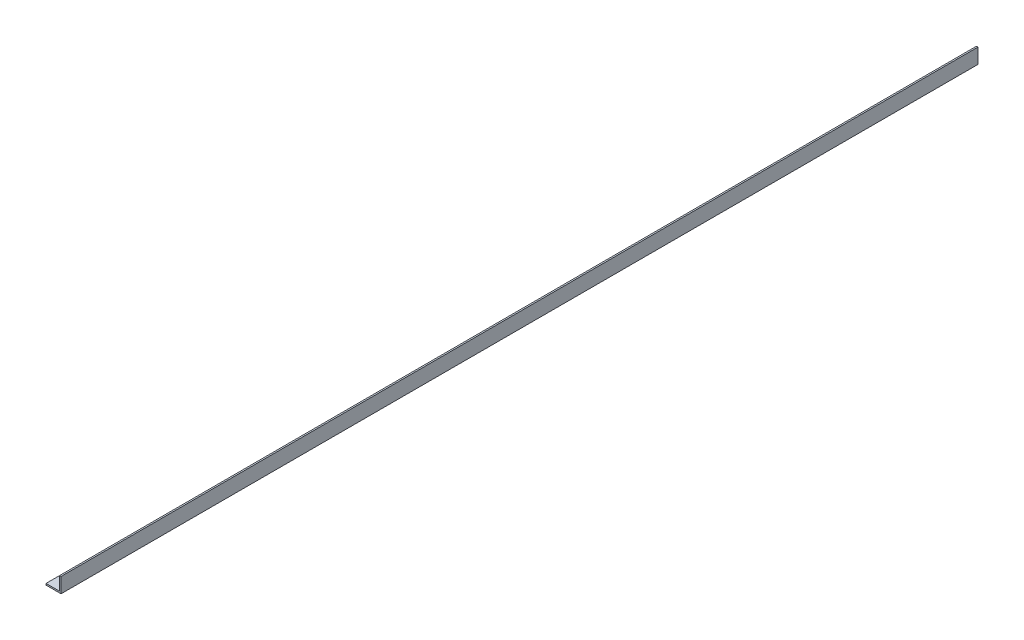
ISO-10303-21;
HEADER;
FILE_DESCRIPTION(('STEP AP214'),'2;1');
FILE_NAME('part.step','',(''),(''),'','','');
FILE_SCHEMA(('AUTOMOTIVE_DESIGN { 1 0 10303 214 1 1 1 1 }'));
ENDSEC;
DATA;
#1=APPLICATION_CONTEXT('core data for automotive mechanical design processes');
#2=APPLICATION_PROTOCOL_DEFINITION('international standard','automotive_design',2000,#1);
#3=PRODUCT_CONTEXT('',#1,'mechanical');
#4=PRODUCT('Part','Part','',(#3));
#5=PRODUCT_RELATED_PRODUCT_CATEGORY('part','',(#4));
#6=PRODUCT_DEFINITION_FORMATION('','',#4);
#7=PRODUCT_DEFINITION_CONTEXT('part definition',#1,'design');
#8=PRODUCT_DEFINITION('design','',#6,#7);
#9=PRODUCT_DEFINITION_SHAPE('','',#8);
#10=(LENGTH_UNIT() NAMED_UNIT(*) SI_UNIT(.MILLI.,.METRE.));
#11=(NAMED_UNIT(*) PLANE_ANGLE_UNIT() SI_UNIT($,.RADIAN.));
#12=(NAMED_UNIT(*) SI_UNIT($,.STERADIAN.) SOLID_ANGLE_UNIT());
#13=UNCERTAINTY_MEASURE_WITH_UNIT(LENGTH_MEASURE(1.E-05),#10,'distance_accuracy_value','');
#14=(GEOMETRIC_REPRESENTATION_CONTEXT(3) GLOBAL_UNCERTAINTY_ASSIGNED_CONTEXT((#13)) GLOBAL_UNIT_ASSIGNED_CONTEXT((#10,
#11,#12)) REPRESENTATION_CONTEXT('',''));
#15=CARTESIAN_POINT('',(0.,0.,0.));
#16=DIRECTION('',(0.,0.,1.));
#17=DIRECTION('',(1.,0.,0.));
#18=AXIS2_PLACEMENT_3D('',#15,#16,#17);
#19=CARTESIAN_POINT('',(-10.,0.,304.8));
#20=DIRECTION('',(1.,0.,0.));
#21=DIRECTION('',(0.,0.,-1.));
#22=AXIS2_PLACEMENT_3D('',#19,#20,#21);
#23=PLANE('',#22);
#24=DIRECTION('',(0.,0.,-1.));
#25=VECTOR('',#24,1.);
#26=CARTESIAN_POINT('',(-10.,0.999999999999999,304.8));
#27=LINE('',#26,#25);
#28=CARTESIAN_POINT('',(-10.,0.999999999999999,304.8));
#29=VERTEX_POINT('',#28);
#30=CARTESIAN_POINT('',(-10.,0.999999999999999,-304.8));
#31=VERTEX_POINT('',#30);
#32=EDGE_CURVE('E119',#29,#31,#27,.T.);
#33=ORIENTED_EDGE('',*,*,#32,.T.);
#34=DIRECTION('',(0.,-1.,0.));
#35=VECTOR('',#34,1.);
#36=CARTESIAN_POINT('',(-10.,0.,-304.8));
#37=LINE('',#36,#35);
#38=CARTESIAN_POINT('',(-10.,0.,-304.8));
#39=VERTEX_POINT('',#38);
#40=EDGE_CURVE('E112',#31,#39,#37,.T.);
#41=ORIENTED_EDGE('',*,*,#40,.T.);
#42=DIRECTION('',(0.,0.,-1.));
#43=VECTOR('',#42,1.);
#44=CARTESIAN_POINT('',(-10.,0.,304.8));
#45=LINE('',#44,#43);
#46=CARTESIAN_POINT('',(-10.,0.,304.8));
#47=VERTEX_POINT('',#46);
#48=EDGE_CURVE('E11',#47,#39,#45,.T.);
#49=ORIENTED_EDGE('',*,*,#48,.F.);
#50=DIRECTION('',(0.,-1.,0.));
#51=VECTOR('',#50,1.);
#52=CARTESIAN_POINT('',(-10.,0.,304.8));
#53=LINE('',#52,#51);
#54=EDGE_CURVE('E136',#29,#47,#53,.T.);
#55=ORIENTED_EDGE('',*,*,#54,.F.);
#56=EDGE_LOOP('',(#33,#41,#49,#55));
#57=FACE_BOUND('',#56,.T.);
#58=ADVANCED_FACE('F47',(#57),#23,.F.);
#59=CARTESIAN_POINT('',(-10.,0.,304.8));
#60=DIRECTION('',(0.,1.,0.));
#61=DIRECTION('',(0.,0.,1.));
#62=AXIS2_PLACEMENT_3D('',#59,#60,#61);
#63=PLANE('',#62);
#64=ORIENTED_EDGE('',*,*,#48,.T.);
#65=DIRECTION('',(1.,0.,0.));
#66=VECTOR('',#65,1.);
#67=CARTESIAN_POINT('',(-10.,0.,-304.8));
#68=LINE('',#67,#66);
#69=CARTESIAN_POINT('',(0.,0.,-304.8));
#70=VERTEX_POINT('',#69);
#71=EDGE_CURVE('E102',#39,#70,#68,.T.);
#72=ORIENTED_EDGE('',*,*,#71,.T.);
#73=DIRECTION('',(0.,0.,-1.));
#74=VECTOR('',#73,1.);
#75=CARTESIAN_POINT('',(0.,0.,304.8));
#76=LINE('',#75,#74);
#77=CARTESIAN_POINT('',(0.,0.,304.8));
#78=VERTEX_POINT('',#77);
#79=EDGE_CURVE('E55',#78,#70,#76,.T.);
#80=ORIENTED_EDGE('',*,*,#79,.F.);
#81=DIRECTION('',(1.,0.,0.));
#82=VECTOR('',#81,1.);
#83=CARTESIAN_POINT('',(-10.,0.,304.8));
#84=LINE('',#83,#82);
#85=EDGE_CURVE('E103',#47,#78,#84,.T.);
#86=ORIENTED_EDGE('',*,*,#85,.F.);
#87=EDGE_LOOP('',(#64,#72,#80,#86));
#88=FACE_BOUND('',#87,.T.);
#89=ADVANCED_FACE('F100',(#88),#63,.F.);
#90=CARTESIAN_POINT('',(0.,0.,304.8));
#91=DIRECTION('',(-1.,0.,0.));
#92=DIRECTION('',(0.,0.,1.));
#93=AXIS2_PLACEMENT_3D('',#90,#91,#92);
#94=PLANE('',#93);
#95=ORIENTED_EDGE('',*,*,#79,.T.);
#96=DIRECTION('',(0.,1.,0.));
#97=VECTOR('',#96,1.);
#98=CARTESIAN_POINT('',(0.,0.,-304.8));
#99=LINE('',#98,#97);
#100=CARTESIAN_POINT('',(0.,10.,-304.8));
#101=VERTEX_POINT('',#100);
#102=EDGE_CURVE('E116',#70,#101,#99,.T.);
#103=ORIENTED_EDGE('',*,*,#102,.T.);
#104=DIRECTION('',(0.,0.,-1.));
#105=VECTOR('',#104,1.);
#106=CARTESIAN_POINT('',(0.,10.,304.8));
#107=LINE('',#106,#105);
#108=CARTESIAN_POINT('',(0.,10.,304.8));
#109=VERTEX_POINT('',#108);
#110=EDGE_CURVE('E159',#109,#101,#107,.T.);
#111=ORIENTED_EDGE('',*,*,#110,.F.);
#112=DIRECTION('',(0.,1.,0.));
#113=VECTOR('',#112,1.);
#114=CARTESIAN_POINT('',(0.,0.,304.8));
#115=LINE('',#114,#113);
#116=EDGE_CURVE('E141',#78,#109,#115,.T.);
#117=ORIENTED_EDGE('',*,*,#116,.F.);
#118=EDGE_LOOP('',(#95,#103,#111,#117));
#119=FACE_BOUND('',#118,.T.);
#120=ADVANCED_FACE('F164',(#119),#94,.F.);
#121=CARTESIAN_POINT('',(0.,10.,304.8));
#122=DIRECTION('',(0.,-1.,0.));
#123=DIRECTION('',(0.,0.,-1.));
#124=AXIS2_PLACEMENT_3D('',#121,#122,#123);
#125=PLANE('',#124);
#126=ORIENTED_EDGE('',*,*,#110,.T.);
#127=DIRECTION('',(-1.,0.,0.));
#128=VECTOR('',#127,1.);
#129=CARTESIAN_POINT('',(0.,10.,-304.8));
#130=LINE('',#129,#128);
#131=CARTESIAN_POINT('',(-0.999999999999999,10.,-304.8));
#132=VERTEX_POINT('',#131);
#133=EDGE_CURVE('E125',#101,#132,#130,.T.);
#134=ORIENTED_EDGE('',*,*,#133,.T.);
#135=DIRECTION('',(0.,0.,-1.));
#136=VECTOR('',#135,1.);
#137=CARTESIAN_POINT('',(-0.999999999999999,10.,304.8));
#138=LINE('',#137,#136);
#139=CARTESIAN_POINT('',(-0.999999999999999,10.,304.8));
#140=VERTEX_POINT('',#139);
#141=EDGE_CURVE('E156',#140,#132,#138,.T.);
#142=ORIENTED_EDGE('',*,*,#141,.F.);
#143=DIRECTION('',(-1.,0.,0.));
#144=VECTOR('',#143,1.);
#145=CARTESIAN_POINT('',(0.,10.,304.8));
#146=LINE('',#145,#144);
#147=EDGE_CURVE('E144',#109,#140,#146,.T.);
#148=ORIENTED_EDGE('',*,*,#147,.F.);
#149=EDGE_LOOP('',(#126,#134,#142,#148));
#150=FACE_BOUND('',#149,.T.);
#151=ADVANCED_FACE('F170',(#150),#125,.F.);
#152=CARTESIAN_POINT('',(-0.999999999999999,10.,304.8));
#153=DIRECTION('',(1.,0.,0.));
#154=DIRECTION('',(0.,1.,0.));
#155=AXIS2_PLACEMENT_3D('',#152,#153,#154);
#156=PLANE('',#155);
#157=ORIENTED_EDGE('',*,*,#141,.T.);
#158=DIRECTION('',(0.,-1.,0.));
#159=VECTOR('',#158,1.);
#160=CARTESIAN_POINT('',(-0.999999999999999,10.,-304.8));
#161=LINE('',#160,#159);
#162=CARTESIAN_POINT('',(-0.999999999999997,0.999999999999999,-304.8));
#163=VERTEX_POINT('',#162);
#164=EDGE_CURVE('E129',#132,#163,#161,.T.);
#165=ORIENTED_EDGE('',*,*,#164,.T.);
#166=DIRECTION('',(0.,0.,-1.));
#167=VECTOR('',#166,1.);
#168=CARTESIAN_POINT('',(-0.999999999999997,0.999999999999999,304.8));
#169=LINE('',#168,#167);
#170=CARTESIAN_POINT('',(-0.999999999999997,0.999999999999999,304.8));
#171=VERTEX_POINT('',#170);
#172=EDGE_CURVE('E153',#171,#163,#169,.T.);
#173=ORIENTED_EDGE('',*,*,#172,.F.);
#174=DIRECTION('',(0.,-1.,0.));
#175=VECTOR('',#174,1.);
#176=CARTESIAN_POINT('',(-0.999999999999999,10.,304.8));
#177=LINE('',#176,#175);
#178=EDGE_CURVE('E67',#140,#171,#177,.T.);
#179=ORIENTED_EDGE('',*,*,#178,.F.);
#180=EDGE_LOOP('',(#157,#165,#173,#179));
#181=FACE_BOUND('',#180,.T.);
#182=ADVANCED_FACE('F173',(#181),#156,.F.);
#183=CARTESIAN_POINT('',(-0.999999999999997,0.999999999999999,304.8));
#184=DIRECTION('',(0.,-1.,0.));
#185=DIRECTION('',(1.,0.,0.));
#186=AXIS2_PLACEMENT_3D('',#183,#184,#185);
#187=PLANE('',#186);
#188=ORIENTED_EDGE('',*,*,#172,.T.);
#189=DIRECTION('',(-1.,0.,0.));
#190=VECTOR('',#189,1.);
#191=CARTESIAN_POINT('',(-0.999999999999997,0.999999999999999,-304.8));
#192=LINE('',#191,#190);
#193=EDGE_CURVE('E133',#163,#31,#192,.T.);
#194=ORIENTED_EDGE('',*,*,#193,.T.);
#195=ORIENTED_EDGE('',*,*,#32,.F.);
#196=DIRECTION('',(-1.,0.,0.));
#197=VECTOR('',#196,1.);
#198=CARTESIAN_POINT('',(-0.999999999999997,0.999999999999999,304.8));
#199=LINE('',#198,#197);
#200=EDGE_CURVE('E62',#171,#29,#199,.T.);
#201=ORIENTED_EDGE('',*,*,#200,.F.);
#202=EDGE_LOOP('',(#188,#194,#195,#201));
#203=FACE_BOUND('',#202,.T.);
#204=ADVANCED_FACE('F175',(#203),#187,.F.);
#205=CARTESIAN_POINT('',(0.,0.,304.8));
#206=DIRECTION('',(0.,0.,1.));
#207=DIRECTION('',(1.,0.,0.));
#208=AXIS2_PLACEMENT_3D('',#205,#206,#207);
#209=PLANE('',#208);
#210=ORIENTED_EDGE('',*,*,#54,.T.);
#211=ORIENTED_EDGE('',*,*,#85,.T.);
#212=ORIENTED_EDGE('',*,*,#116,.T.);
#213=ORIENTED_EDGE('',*,*,#147,.T.);
#214=ORIENTED_EDGE('',*,*,#178,.T.);
#215=ORIENTED_EDGE('',*,*,#200,.T.);
#216=EDGE_LOOP('',(#210,#211,#212,#213,#214,#215));
#217=FACE_BOUND('',#216,.T.);
#218=ADVANCED_FACE('F167',(#217),#209,.T.);
#219=CARTESIAN_POINT('',(0.,0.,-304.8));
#220=DIRECTION('',(0.,0.,1.));
#221=DIRECTION('',(1.,0.,0.));
#222=AXIS2_PLACEMENT_3D('',#219,#220,#221);
#223=PLANE('',#222);
#224=ORIENTED_EDGE('',*,*,#40,.F.);
#225=ORIENTED_EDGE('',*,*,#193,.F.);
#226=ORIENTED_EDGE('',*,*,#164,.F.);
#227=ORIENTED_EDGE('',*,*,#133,.F.);
#228=ORIENTED_EDGE('',*,*,#102,.F.);
#229=ORIENTED_EDGE('',*,*,#71,.F.);
#230=EDGE_LOOP('',(#224,#225,#226,#227,#228,#229));
#231=FACE_BOUND('',#230,.T.);
#232=ADVANCED_FACE('F110',(#231),#223,.F.);
#233=CLOSED_SHELL('',(#58,#89,#120,#151,#182,#204,#218,#232));
#234=MANIFOLD_SOLID_BREP('B2',#233);
#235=ADVANCED_BREP_SHAPE_REPRESENTATION('',(#18,#234),#14);
#236=SHAPE_DEFINITION_REPRESENTATION(#9,#235);
ENDSEC;
END-ISO-10303-21;
